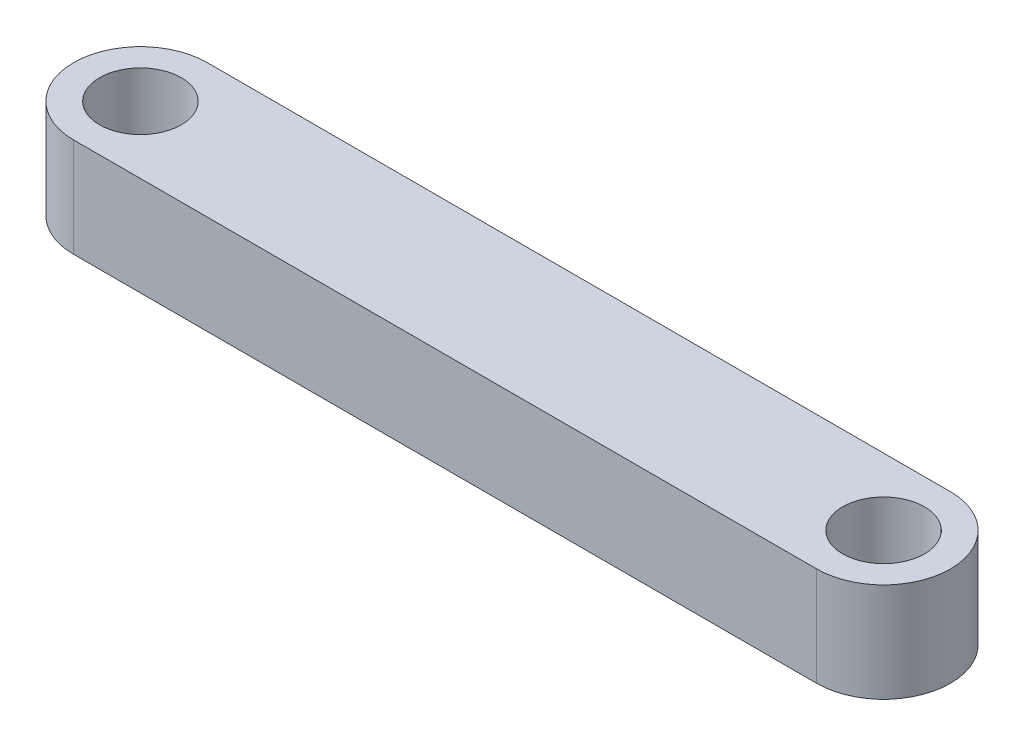
ISO-10303-21;
HEADER;
FILE_DESCRIPTION(('STEP AP214'),'2;1');
FILE_NAME('part.step','',(''),(''),'','','');
FILE_SCHEMA(('AUTOMOTIVE_DESIGN { 1 0 10303 214 1 1 1 1 }'));
ENDSEC;
DATA;
#1=APPLICATION_CONTEXT('core data for automotive mechanical design processes');
#2=APPLICATION_PROTOCOL_DEFINITION('international standard','automotive_design',2000,#1);
#3=PRODUCT_CONTEXT('',#1,'mechanical');
#4=PRODUCT('Part','Part','',(#3));
#5=PRODUCT_RELATED_PRODUCT_CATEGORY('part','',(#4));
#6=PRODUCT_DEFINITION_FORMATION('','',#4);
#7=PRODUCT_DEFINITION_CONTEXT('part definition',#1,'design');
#8=PRODUCT_DEFINITION('design','',#6,#7);
#9=PRODUCT_DEFINITION_SHAPE('','',#8);
#10=(LENGTH_UNIT() NAMED_UNIT(*) SI_UNIT(.MILLI.,.METRE.));
#11=(NAMED_UNIT(*) PLANE_ANGLE_UNIT() SI_UNIT($,.RADIAN.));
#12=(NAMED_UNIT(*) SI_UNIT($,.STERADIAN.) SOLID_ANGLE_UNIT());
#13=UNCERTAINTY_MEASURE_WITH_UNIT(LENGTH_MEASURE(1.E-05),#10,'distance_accuracy_value','');
#14=(GEOMETRIC_REPRESENTATION_CONTEXT(3) GLOBAL_UNCERTAINTY_ASSIGNED_CONTEXT((#13)) GLOBAL_UNIT_ASSIGNED_CONTEXT((#10,
#11,#12)) REPRESENTATION_CONTEXT('',''));
#15=CARTESIAN_POINT('',(0.,0.,0.));
#16=DIRECTION('',(0.,0.,1.));
#17=DIRECTION('',(1.,0.,0.));
#18=AXIS2_PLACEMENT_3D('',#15,#16,#17);
#19=CARTESIAN_POINT('',(-5.38329806567128,8.,-14.2617020778726));
#20=DIRECTION('',(0.,1.,0.));
#21=DIRECTION('',(1.,0.,0.));
#22=AXIS2_PLACEMENT_3D('',#19,#20,#21);
#23=PLANE('',#22);
#24=CARTESIAN_POINT('',(-20.3832980656713,8.,-14.2617020778726));
#25=DIRECTION('',(0.,-1.,0.));
#26=DIRECTION('',(-1.,0.,0.));
#27=AXIS2_PLACEMENT_3D('',#24,#25,#26);
#28=CIRCLE('',#27,1.65);
#29=CARTESIAN_POINT('',(-18.7332980656713,8.,-14.2617020778726));
#30=VERTEX_POINT('',#29);
#31=EDGE_CURVE('E136',#30,#30,#28,.T.);
#32=ORIENTED_EDGE('',*,*,#31,.F.);
#33=EDGE_LOOP('',(#32));
#34=FACE_BOUND('',#33,.T.);
#35=CARTESIAN_POINT('',(9.61670193432872,8.,-14.2617020778726));
#36=DIRECTION('',(0.,-1.,0.));
#37=DIRECTION('',(-1.,0.,0.));
#38=AXIS2_PLACEMENT_3D('',#35,#36,#37);
#39=CIRCLE('',#38,1.65);
#40=CARTESIAN_POINT('',(11.2667019343287,8.,-14.2617020778726));
#41=VERTEX_POINT('',#40);
#42=EDGE_CURVE('E125',#41,#41,#39,.T.);
#43=ORIENTED_EDGE('',*,*,#42,.F.);
#44=EDGE_LOOP('',(#43));
#45=FACE_BOUND('',#44,.T.);
#46=CARTESIAN_POINT('',(9.61670193432872,8.,-14.2617020778726));
#47=DIRECTION('',(0.,1.,0.));
#48=DIRECTION('',(-1.,0.,0.));
#49=AXIS2_PLACEMENT_3D('',#46,#47,#48);
#50=CIRCLE('',#49,2.7);
#51=CARTESIAN_POINT('',(9.61670185525302,8.,-11.5617020778726));
#52=VERTEX_POINT('',#51);
#53=CARTESIAN_POINT('',(9.61670193432872,8.,-16.9617020778726));
#54=VERTEX_POINT('',#53);
#55=EDGE_CURVE('E25',#52,#54,#50,.T.);
#56=ORIENTED_EDGE('',*,*,#55,.F.);
#57=DIRECTION('',(-1.,0.,0.));
#58=VECTOR('',#57,1.);
#59=CARTESIAN_POINT('',(-12.8832980656713,8.,-11.5617020778726));
#60=LINE('',#59,#58);
#61=CARTESIAN_POINT('',(-20.3832980656713,8.,-11.5617020778726));
#62=VERTEX_POINT('',#61);
#63=EDGE_CURVE('E108',#52,#62,#60,.T.);
#64=ORIENTED_EDGE('',*,*,#63,.T.);
#65=CARTESIAN_POINT('',(-20.3832980656713,8.,-14.2617020778726));
#66=DIRECTION('',(0.,1.,0.));
#67=DIRECTION('',(-1.,0.,0.));
#68=AXIS2_PLACEMENT_3D('',#65,#66,#67);
#69=CIRCLE('',#68,2.7);
#70=CARTESIAN_POINT('',(-20.3832980656713,8.,-16.9617020778726));
#71=VERTEX_POINT('',#70);
#72=EDGE_CURVE('E102',#71,#62,#69,.T.);
#73=ORIENTED_EDGE('',*,*,#72,.F.);
#74=DIRECTION('',(1.,0.,0.));
#75=VECTOR('',#74,1.);
#76=CARTESIAN_POINT('',(2.11670193432872,8.,-16.9617020778726));
#77=LINE('',#76,#75);
#78=EDGE_CURVE('E89',#71,#54,#77,.T.);
#79=ORIENTED_EDGE('',*,*,#78,.T.);
#80=EDGE_LOOP('',(#56,#64,#73,#79));
#81=FACE_BOUND('',#80,.T.);
#82=ADVANCED_FACE('F16',(#34,#45,#81),#23,.F.);
#83=CARTESIAN_POINT('',(-5.38329806567128,12.,-14.2617020778726));
#84=DIRECTION('',(0.,1.,0.));
#85=DIRECTION('',(1.,0.,0.));
#86=AXIS2_PLACEMENT_3D('',#83,#84,#85);
#87=PLANE('',#86);
#88=CARTESIAN_POINT('',(-20.3832980656713,12.,-14.2617020778726));
#89=DIRECTION('',(0.,-1.,0.));
#90=DIRECTION('',(-1.,0.,0.));
#91=AXIS2_PLACEMENT_3D('',#88,#89,#90);
#92=CIRCLE('',#91,1.65);
#93=CARTESIAN_POINT('',(-18.7332980656713,12.,-14.2617020778726));
#94=VERTEX_POINT('',#93);
#95=EDGE_CURVE('E129',#94,#94,#92,.T.);
#96=ORIENTED_EDGE('',*,*,#95,.T.);
#97=EDGE_LOOP('',(#96));
#98=FACE_BOUND('',#97,.T.);
#99=CARTESIAN_POINT('',(9.61670193432872,12.,-14.2617020778726));
#100=DIRECTION('',(0.,-1.,0.));
#101=DIRECTION('',(-1.,0.,0.));
#102=AXIS2_PLACEMENT_3D('',#99,#100,#101);
#103=CIRCLE('',#102,1.65);
#104=CARTESIAN_POINT('',(11.2667019343287,12.,-14.2617020778726));
#105=VERTEX_POINT('',#104);
#106=EDGE_CURVE('E138',#105,#105,#103,.T.);
#107=ORIENTED_EDGE('',*,*,#106,.T.);
#108=EDGE_LOOP('',(#107));
#109=FACE_BOUND('',#108,.T.);
#110=CARTESIAN_POINT('',(9.61670193432872,12.,-14.2617020778726));
#111=DIRECTION('',(0.,1.,0.));
#112=DIRECTION('',(-1.,0.,0.));
#113=AXIS2_PLACEMENT_3D('',#110,#111,#112);
#114=CIRCLE('',#113,2.7);
#115=CARTESIAN_POINT('',(9.61670185525302,12.,-11.5617020778726));
#116=VERTEX_POINT('',#115);
#117=CARTESIAN_POINT('',(9.61670193432872,12.,-16.9617020778726));
#118=VERTEX_POINT('',#117);
#119=EDGE_CURVE('E11',#116,#118,#114,.T.);
#120=ORIENTED_EDGE('',*,*,#119,.T.);
#121=DIRECTION('',(-1.,0.,0.));
#122=VECTOR('',#121,1.);
#123=CARTESIAN_POINT('',(2.11670193432872,12.,-16.9617020778726));
#124=LINE('',#123,#122);
#125=CARTESIAN_POINT('',(-20.3832980656713,12.,-16.9617020778726));
#126=VERTEX_POINT('',#125);
#127=EDGE_CURVE('E98',#118,#126,#124,.T.);
#128=ORIENTED_EDGE('',*,*,#127,.T.);
#129=CARTESIAN_POINT('',(-20.3832980656713,12.,-14.2617020778726));
#130=DIRECTION('',(0.,1.,0.));
#131=DIRECTION('',(-1.,0.,0.));
#132=AXIS2_PLACEMENT_3D('',#129,#130,#131);
#133=CIRCLE('',#132,2.7);
#134=CARTESIAN_POINT('',(-20.3832980656713,12.,-11.5617020778726));
#135=VERTEX_POINT('',#134);
#136=EDGE_CURVE('E81',#126,#135,#133,.T.);
#137=ORIENTED_EDGE('',*,*,#136,.T.);
#138=DIRECTION('',(1.,0.,0.));
#139=VECTOR('',#138,1.);
#140=CARTESIAN_POINT('',(-12.8832980656713,12.,-11.5617020778726));
#141=LINE('',#140,#139);
#142=EDGE_CURVE('E117',#135,#116,#141,.T.);
#143=ORIENTED_EDGE('',*,*,#142,.T.);
#144=EDGE_LOOP('',(#120,#128,#137,#143));
#145=FACE_BOUND('',#144,.T.);
#146=ADVANCED_FACE('F159',(#98,#109,#145),#87,.T.);
#147=CARTESIAN_POINT('',(9.61670193432872,8.,-14.2617020778726));
#148=DIRECTION('',(0.,1.,0.));
#149=DIRECTION('',(1.,0.,1.46436473061966E-08));
#150=AXIS2_PLACEMENT_3D('',#147,#148,#149);
#151=CYLINDRICAL_SURFACE('',#150,2.7);
#152=ORIENTED_EDGE('',*,*,#55,.T.);
#153=DIRECTION('',(0.,1.,0.));
#154=VECTOR('',#153,1.);
#155=CARTESIAN_POINT('',(9.61670193432872,8.,-16.9617020778726));
#156=LINE('',#155,#154);
#157=EDGE_CURVE('E94',#54,#118,#156,.T.);
#158=ORIENTED_EDGE('',*,*,#157,.T.);
#159=ORIENTED_EDGE('',*,*,#119,.F.);
#160=DIRECTION('',(0.,1.,0.));
#161=VECTOR('',#160,1.);
#162=CARTESIAN_POINT('',(9.61670185525302,8.,-11.5617020778726));
#163=LINE('',#162,#161);
#164=EDGE_CURVE('E124',#52,#116,#163,.T.);
#165=ORIENTED_EDGE('',*,*,#164,.F.);
#166=EDGE_LOOP('',(#152,#158,#159,#165));
#167=FACE_BOUND('',#166,.T.);
#168=ADVANCED_FACE('F161',(#167),#151,.T.);
#169=CARTESIAN_POINT('',(9.61670193432872,8.,-16.9617020778726));
#170=DIRECTION('',(0.,0.,-1.));
#171=DIRECTION('',(0.,-1.,0.));
#172=AXIS2_PLACEMENT_3D('',#169,#170,#171);
#173=PLANE('',#172);
#174=ORIENTED_EDGE('',*,*,#78,.F.);
#175=DIRECTION('',(0.,1.,0.));
#176=VECTOR('',#175,1.);
#177=CARTESIAN_POINT('',(-20.3832980656713,8.,-16.9617020778726));
#178=LINE('',#177,#176);
#179=EDGE_CURVE('E93',#71,#126,#178,.T.);
#180=ORIENTED_EDGE('',*,*,#179,.T.);
#181=ORIENTED_EDGE('',*,*,#127,.F.);
#182=ORIENTED_EDGE('',*,*,#157,.F.);
#183=EDGE_LOOP('',(#174,#180,#181,#182));
#184=FACE_BOUND('',#183,.T.);
#185=ADVANCED_FACE('F91',(#184),#173,.T.);
#186=CARTESIAN_POINT('',(-20.3832980656713,8.,-14.2617020778726));
#187=DIRECTION('',(0.,1.,0.));
#188=DIRECTION('',(-1.,0.,0.));
#189=AXIS2_PLACEMENT_3D('',#186,#187,#188);
#190=CYLINDRICAL_SURFACE('',#189,2.7);
#191=ORIENTED_EDGE('',*,*,#72,.T.);
#192=DIRECTION('',(0.,1.,0.));
#193=VECTOR('',#192,1.);
#194=CARTESIAN_POINT('',(-20.3832980656713,8.,-11.5617020778726));
#195=LINE('',#194,#193);
#196=EDGE_CURVE('E110',#62,#135,#195,.T.);
#197=ORIENTED_EDGE('',*,*,#196,.T.);
#198=ORIENTED_EDGE('',*,*,#136,.F.);
#199=ORIENTED_EDGE('',*,*,#179,.F.);
#200=EDGE_LOOP('',(#191,#197,#198,#199));
#201=FACE_BOUND('',#200,.T.);
#202=ADVANCED_FACE('F101',(#201),#190,.T.);
#203=CARTESIAN_POINT('',(-20.3832980656713,8.,-11.5617020778726));
#204=DIRECTION('',(0.,0.,1.));
#205=DIRECTION('',(1.,0.,0.));
#206=AXIS2_PLACEMENT_3D('',#203,#204,#205);
#207=PLANE('',#206);
#208=ORIENTED_EDGE('',*,*,#63,.F.);
#209=ORIENTED_EDGE('',*,*,#164,.T.);
#210=ORIENTED_EDGE('',*,*,#142,.F.);
#211=ORIENTED_EDGE('',*,*,#196,.F.);
#212=EDGE_LOOP('',(#208,#209,#210,#211));
#213=FACE_BOUND('',#212,.T.);
#214=ADVANCED_FACE('F174',(#213),#207,.T.);
#215=CARTESIAN_POINT('',(9.61670193432872,8.,-14.2617020778726));
#216=DIRECTION('',(0.,1.,0.));
#217=DIRECTION('',(-1.,0.,0.));
#218=AXIS2_PLACEMENT_3D('',#215,#216,#217);
#219=CYLINDRICAL_SURFACE('',#218,1.65);
#220=ORIENTED_EDGE('',*,*,#106,.F.);
#221=DIRECTION('',(0.,-1.,0.));
#222=VECTOR('',#221,1.);
#223=CARTESIAN_POINT('',(11.2667019343287,8.,-14.2617020778726));
#224=LINE('',#223,#222);
#225=EDGE_CURVE('E120',#105,#41,#224,.T.);
#226=ORIENTED_EDGE('',*,*,#225,.T.);
#227=ORIENTED_EDGE('',*,*,#42,.T.);
#228=ORIENTED_EDGE('',*,*,#225,.F.);
#229=EDGE_LOOP('',(#220,#226,#227,#228));
#230=FACE_BOUND('',#229,.T.);
#231=ADVANCED_FACE('F157',(#230),#219,.F.);
#232=CARTESIAN_POINT('',(-20.3832980656713,8.,-14.2617020778726));
#233=DIRECTION('',(0.,1.,0.));
#234=DIRECTION('',(-1.,0.,0.));
#235=AXIS2_PLACEMENT_3D('',#232,#233,#234);
#236=CYLINDRICAL_SURFACE('',#235,1.65);
#237=ORIENTED_EDGE('',*,*,#95,.F.);
#238=DIRECTION('',(0.,-1.,0.));
#239=VECTOR('',#238,1.);
#240=CARTESIAN_POINT('',(-18.7332980656713,8.,-14.2617020778726));
#241=LINE('',#240,#239);
#242=EDGE_CURVE('E133',#94,#30,#241,.T.);
#243=ORIENTED_EDGE('',*,*,#242,.T.);
#244=ORIENTED_EDGE('',*,*,#31,.T.);
#245=ORIENTED_EDGE('',*,*,#242,.F.);
#246=EDGE_LOOP('',(#237,#243,#244,#245));
#247=FACE_BOUND('',#246,.T.);
#248=ADVANCED_FACE('F18',(#247),#236,.F.);
#249=CLOSED_SHELL('',(#82,#146,#168,#185,#202,#214,#231,#248));
#250=MANIFOLD_SOLID_BREP('B1',#249);
#251=ADVANCED_BREP_SHAPE_REPRESENTATION('',(#18,#250),#14);
#252=SHAPE_DEFINITION_REPRESENTATION(#9,#251);
ENDSEC;
END-ISO-10303-21;
